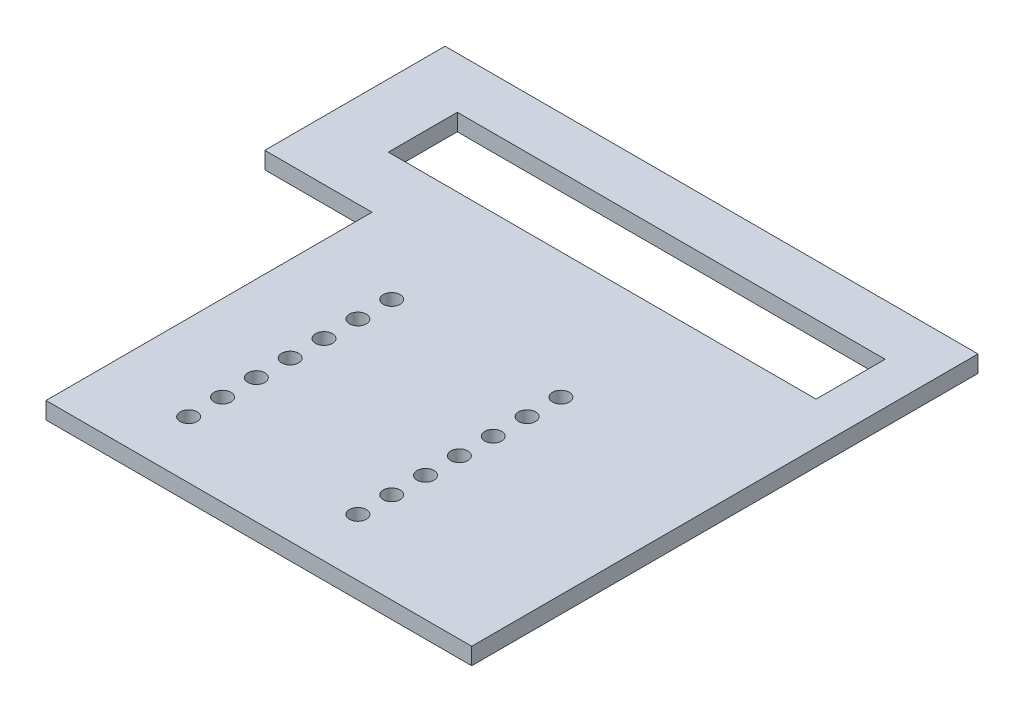
ISO-10303-21;
HEADER;
FILE_DESCRIPTION(('STEP AP214'),'2;1');
FILE_NAME('part.step','',(''),(''),'','','');
FILE_SCHEMA(('AUTOMOTIVE_DESIGN { 1 0 10303 214 1 1 1 1 }'));
ENDSEC;
DATA;
#1=APPLICATION_CONTEXT('core data for automotive mechanical design processes');
#2=APPLICATION_PROTOCOL_DEFINITION('international standard','automotive_design',2000,#1);
#3=PRODUCT_CONTEXT('',#1,'mechanical');
#4=PRODUCT('Part','Part','',(#3));
#5=PRODUCT_RELATED_PRODUCT_CATEGORY('part','',(#4));
#6=PRODUCT_DEFINITION_FORMATION('','',#4);
#7=PRODUCT_DEFINITION_CONTEXT('part definition',#1,'design');
#8=PRODUCT_DEFINITION('design','',#6,#7);
#9=PRODUCT_DEFINITION_SHAPE('','',#8);
#10=(LENGTH_UNIT() NAMED_UNIT(*) SI_UNIT(.MILLI.,.METRE.));
#11=(NAMED_UNIT(*) PLANE_ANGLE_UNIT() SI_UNIT($,.RADIAN.));
#12=(NAMED_UNIT(*) SI_UNIT($,.STERADIAN.) SOLID_ANGLE_UNIT());
#13=UNCERTAINTY_MEASURE_WITH_UNIT(LENGTH_MEASURE(1.E-05),#10,'distance_accuracy_value','');
#14=(GEOMETRIC_REPRESENTATION_CONTEXT(3) GLOBAL_UNCERTAINTY_ASSIGNED_CONTEXT((#13)) GLOBAL_UNIT_ASSIGNED_CONTEXT((#10,
#11,#12)) REPRESENTATION_CONTEXT('',''));
#15=CARTESIAN_POINT('',(0.,0.,0.));
#16=DIRECTION('',(0.,0.,1.));
#17=DIRECTION('',(1.,0.,0.));
#18=AXIS2_PLACEMENT_3D('',#15,#16,#17);
#19=CARTESIAN_POINT('',(-80.,-3.175,-112.5));
#20=DIRECTION('',(0.,0.,-1.));
#21=DIRECTION('',(-1.,0.,0.));
#22=AXIS2_PLACEMENT_3D('',#19,#20,#21);
#23=PLANE('',#22);
#24=DIRECTION('',(0.,-1.,0.));
#25=VECTOR('',#24,1.);
#26=CARTESIAN_POINT('',(0.,-3.175,-112.5));
#27=LINE('',#26,#25);
#28=CARTESIAN_POINT('',(0.,0.,-112.5));
#29=VERTEX_POINT('',#28);
#30=CARTESIAN_POINT('',(0.,-3.175,-112.5));
#31=VERTEX_POINT('',#30);
#32=EDGE_CURVE('E149',#29,#31,#27,.T.);
#33=ORIENTED_EDGE('',*,*,#32,.F.);
#34=DIRECTION('',(-1.,0.,0.));
#35=VECTOR('',#34,1.);
#36=CARTESIAN_POINT('',(-80.,0.,-112.5));
#37=LINE('',#36,#35);
#38=CARTESIAN_POINT('',(100.,0.,-112.5));
#39=VERTEX_POINT('',#38);
#40=EDGE_CURVE('E267',#39,#29,#37,.T.);
#41=ORIENTED_EDGE('',*,*,#40,.F.);
#42=DIRECTION('',(0.,1.,0.));
#43=VECTOR('',#42,1.);
#44=CARTESIAN_POINT('',(100.,-3.175,-112.5));
#45=LINE('',#44,#43);
#46=CARTESIAN_POINT('',(100.,-3.175,-112.5));
#47=VERTEX_POINT('',#46);
#48=EDGE_CURVE('E11',#47,#39,#45,.T.);
#49=ORIENTED_EDGE('',*,*,#48,.F.);
#50=DIRECTION('',(-1.,0.,0.));
#51=VECTOR('',#50,1.);
#52=CARTESIAN_POINT('',(-80.,-3.175,-112.5));
#53=LINE('',#52,#51);
#54=EDGE_CURVE('E41',#47,#31,#53,.T.);
#55=ORIENTED_EDGE('',*,*,#54,.T.);
#56=EDGE_LOOP('',(#33,#41,#49,#55));
#57=FACE_BOUND('',#56,.T.);
#58=ADVANCED_FACE('F33',(#57),#23,.T.);
#59=CARTESIAN_POINT('',(100.,-3.175,-112.5));
#60=DIRECTION('',(1.,0.,0.));
#61=DIRECTION('',(0.,0.,-1.));
#62=AXIS2_PLACEMENT_3D('',#59,#60,#61);
#63=PLANE('',#62);
#64=DIRECTION('',(0.,1.,0.));
#65=VECTOR('',#64,1.);
#66=CARTESIAN_POINT('',(100.,-3.175,-17.4996584070186));
#67=LINE('',#66,#65);
#68=CARTESIAN_POINT('',(100.,-3.175,-17.4996584070186));
#69=VERTEX_POINT('',#68);
#70=CARTESIAN_POINT('',(100.,0.,-17.4996584070186));
#71=VERTEX_POINT('',#70);
#72=EDGE_CURVE('E48',#69,#71,#67,.T.);
#73=ORIENTED_EDGE('',*,*,#72,.F.);
#74=DIRECTION('',(0.,0.,-1.));
#75=VECTOR('',#74,1.);
#76=CARTESIAN_POINT('',(100.,-3.175,-112.5));
#77=LINE('',#76,#75);
#78=EDGE_CURVE('E131',#69,#47,#77,.T.);
#79=ORIENTED_EDGE('',*,*,#78,.T.);
#80=ORIENTED_EDGE('',*,*,#48,.T.);
#81=DIRECTION('',(0.,0.,-1.));
#82=VECTOR('',#81,1.);
#83=CARTESIAN_POINT('',(100.,0.,-112.5));
#84=LINE('',#83,#82);
#85=EDGE_CURVE('E259',#71,#39,#84,.T.);
#86=ORIENTED_EDGE('',*,*,#85,.F.);
#87=EDGE_LOOP('',(#73,#79,#80,#86));
#88=FACE_BOUND('',#87,.T.);
#89=ADVANCED_FACE('F35',(#88),#63,.T.);
#90=CARTESIAN_POINT('',(-80.,-3.175,0.));
#91=DIRECTION('',(0.,1.,0.));
#92=DIRECTION('',(0.,0.,1.));
#93=AXIS2_PLACEMENT_3D('',#90,#91,#92);
#94=PLANE('',#93);
#95=CARTESIAN_POINT('',(67.8940457021954,-3.175,-28.2447999999999));
#96=DIRECTION('',(0.,1.,0.));
#97=DIRECTION('',(0.,0.,1.));
#98=AXIS2_PLACEMENT_3D('',#95,#96,#97);
#99=CIRCLE('',#98,1.58749999999999);
#100=CARTESIAN_POINT('',(67.8940457021954,-3.175,-26.6573));
#101=VERTEX_POINT('',#100);
#102=EDGE_CURVE('E152',#101,#101,#99,.T.);
#103=ORIENTED_EDGE('',*,*,#102,.T.);
#104=EDGE_LOOP('',(#103));
#105=FACE_BOUND('',#104,.T.);
#106=CARTESIAN_POINT('',(67.8940457021954,-3.175,-34.5947999999999));
#107=DIRECTION('',(0.,1.,0.));
#108=DIRECTION('',(0.,0.,1.));
#109=AXIS2_PLACEMENT_3D('',#106,#107,#108);
#110=CIRCLE('',#109,1.58749999999999);
#111=CARTESIAN_POINT('',(67.8940457021954,-3.175,-33.0073));
#112=VERTEX_POINT('',#111);
#113=EDGE_CURVE('E158',#112,#112,#110,.T.);
#114=ORIENTED_EDGE('',*,*,#113,.T.);
#115=EDGE_LOOP('',(#114));
#116=FACE_BOUND('',#115,.T.);
#117=CARTESIAN_POINT('',(67.8940457021954,-3.175,-40.9448));
#118=DIRECTION('',(0.,1.,0.));
#119=DIRECTION('',(0.,0.,1.));
#120=AXIS2_PLACEMENT_3D('',#117,#118,#119);
#121=CIRCLE('',#120,1.58749999999999);
#122=CARTESIAN_POINT('',(67.8940457021954,-3.175,-39.3573));
#123=VERTEX_POINT('',#122);
#124=EDGE_CURVE('E164',#123,#123,#121,.T.);
#125=ORIENTED_EDGE('',*,*,#124,.T.);
#126=EDGE_LOOP('',(#125));
#127=FACE_BOUND('',#126,.T.);
#128=CARTESIAN_POINT('',(67.8940457021954,-3.175,-47.2948));
#129=DIRECTION('',(0.,1.,0.));
#130=DIRECTION('',(0.,0.,1.));
#131=AXIS2_PLACEMENT_3D('',#128,#129,#130);
#132=CIRCLE('',#131,1.58749999999999);
#133=CARTESIAN_POINT('',(67.8940457021954,-3.175,-45.7073));
#134=VERTEX_POINT('',#133);
#135=EDGE_CURVE('E170',#134,#134,#132,.T.);
#136=ORIENTED_EDGE('',*,*,#135,.T.);
#137=EDGE_LOOP('',(#136));
#138=FACE_BOUND('',#137,.T.);
#139=CARTESIAN_POINT('',(67.8940457021954,-3.175,-53.6448));
#140=DIRECTION('',(0.,1.,0.));
#141=DIRECTION('',(0.,0.,1.));
#142=AXIS2_PLACEMENT_3D('',#139,#140,#141);
#143=CIRCLE('',#142,1.58749999999999);
#144=CARTESIAN_POINT('',(67.8940457021954,-3.175,-52.0573));
#145=VERTEX_POINT('',#144);
#146=EDGE_CURVE('E176',#145,#145,#143,.T.);
#147=ORIENTED_EDGE('',*,*,#146,.T.);
#148=EDGE_LOOP('',(#147));
#149=FACE_BOUND('',#148,.T.);
#150=CARTESIAN_POINT('',(67.8940457021954,-3.175,-59.9948));
#151=DIRECTION('',(0.,1.,0.));
#152=DIRECTION('',(0.,0.,1.));
#153=AXIS2_PLACEMENT_3D('',#150,#151,#152);
#154=CIRCLE('',#153,1.58749999999999);
#155=CARTESIAN_POINT('',(67.8940457021954,-3.175,-58.4073));
#156=VERTEX_POINT('',#155);
#157=EDGE_CURVE('E182',#156,#156,#154,.T.);
#158=ORIENTED_EDGE('',*,*,#157,.T.);
#159=EDGE_LOOP('',(#158));
#160=FACE_BOUND('',#159,.T.);
#161=CARTESIAN_POINT('',(67.8940457021954,-3.175,-66.3448));
#162=DIRECTION('',(0.,1.,0.));
#163=DIRECTION('',(0.,0.,1.));
#164=AXIS2_PLACEMENT_3D('',#161,#162,#163);
#165=CIRCLE('',#164,1.58749999999999);
#166=CARTESIAN_POINT('',(67.8940457021954,-3.175,-64.7573));
#167=VERTEX_POINT('',#166);
#168=EDGE_CURVE('E188',#167,#167,#165,.T.);
#169=ORIENTED_EDGE('',*,*,#168,.T.);
#170=EDGE_LOOP('',(#169));
#171=FACE_BOUND('',#170,.T.);
#172=CARTESIAN_POINT('',(36.1440457021954,-3.175,-28.2447999999999));
#173=DIRECTION('',(0.,1.,0.));
#174=DIRECTION('',(0.,0.,1.));
#175=AXIS2_PLACEMENT_3D('',#172,#173,#174);
#176=CIRCLE('',#175,1.5875);
#177=CARTESIAN_POINT('',(36.1440457021954,-3.175,-26.6572999999999));
#178=VERTEX_POINT('',#177);
#179=EDGE_CURVE('E194',#178,#178,#176,.T.);
#180=ORIENTED_EDGE('',*,*,#179,.T.);
#181=EDGE_LOOP('',(#180));
#182=FACE_BOUND('',#181,.T.);
#183=CARTESIAN_POINT('',(36.1440457021954,-3.175,-34.5947999999999));
#184=DIRECTION('',(0.,1.,0.));
#185=DIRECTION('',(0.,0.,1.));
#186=AXIS2_PLACEMENT_3D('',#183,#184,#185);
#187=CIRCLE('',#186,1.5875);
#188=CARTESIAN_POINT('',(36.1440457021954,-3.175,-33.0072999999999));
#189=VERTEX_POINT('',#188);
#190=EDGE_CURVE('E200',#189,#189,#187,.T.);
#191=ORIENTED_EDGE('',*,*,#190,.T.);
#192=EDGE_LOOP('',(#191));
#193=FACE_BOUND('',#192,.T.);
#194=CARTESIAN_POINT('',(36.1440457021954,-3.175,-40.9448));
#195=DIRECTION('',(0.,1.,0.));
#196=DIRECTION('',(0.,0.,1.));
#197=AXIS2_PLACEMENT_3D('',#194,#195,#196);
#198=CIRCLE('',#197,1.5875);
#199=CARTESIAN_POINT('',(36.1440457021954,-3.175,-39.3573));
#200=VERTEX_POINT('',#199);
#201=EDGE_CURVE('E206',#200,#200,#198,.T.);
#202=ORIENTED_EDGE('',*,*,#201,.T.);
#203=EDGE_LOOP('',(#202));
#204=FACE_BOUND('',#203,.T.);
#205=CARTESIAN_POINT('',(36.1440457021954,-3.175,-47.2948));
#206=DIRECTION('',(0.,1.,0.));
#207=DIRECTION('',(0.,0.,1.));
#208=AXIS2_PLACEMENT_3D('',#205,#206,#207);
#209=CIRCLE('',#208,1.5875);
#210=CARTESIAN_POINT('',(36.1440457021954,-3.175,-45.7073));
#211=VERTEX_POINT('',#210);
#212=EDGE_CURVE('E212',#211,#211,#209,.T.);
#213=ORIENTED_EDGE('',*,*,#212,.T.);
#214=EDGE_LOOP('',(#213));
#215=FACE_BOUND('',#214,.T.);
#216=CARTESIAN_POINT('',(36.1440457021954,-3.175,-53.6447999999999));
#217=DIRECTION('',(0.,1.,0.));
#218=DIRECTION('',(0.,0.,1.));
#219=AXIS2_PLACEMENT_3D('',#216,#217,#218);
#220=CIRCLE('',#219,1.5875);
#221=CARTESIAN_POINT('',(36.1440457021954,-3.175,-52.0572999999999));
#222=VERTEX_POINT('',#221);
#223=EDGE_CURVE('E218',#222,#222,#220,.T.);
#224=ORIENTED_EDGE('',*,*,#223,.T.);
#225=EDGE_LOOP('',(#224));
#226=FACE_BOUND('',#225,.T.);
#227=CARTESIAN_POINT('',(36.1440457021954,-3.175,-59.9948));
#228=DIRECTION('',(0.,1.,0.));
#229=DIRECTION('',(0.,0.,1.));
#230=AXIS2_PLACEMENT_3D('',#227,#228,#229);
#231=CIRCLE('',#230,1.5875);
#232=CARTESIAN_POINT('',(36.1440457021954,-3.175,-58.4073));
#233=VERTEX_POINT('',#232);
#234=EDGE_CURVE('E224',#233,#233,#231,.T.);
#235=ORIENTED_EDGE('',*,*,#234,.T.);
#236=EDGE_LOOP('',(#235));
#237=FACE_BOUND('',#236,.T.);
#238=CARTESIAN_POINT('',(36.1440457021954,-3.175,-66.3448));
#239=DIRECTION('',(0.,1.,0.));
#240=DIRECTION('',(0.,0.,1.));
#241=AXIS2_PLACEMENT_3D('',#238,#239,#240);
#242=CIRCLE('',#241,1.5875);
#243=CARTESIAN_POINT('',(36.1440457021954,-3.175,-64.7573));
#244=VERTEX_POINT('',#243);
#245=EDGE_CURVE('E230',#244,#244,#242,.T.);
#246=ORIENTED_EDGE('',*,*,#245,.T.);
#247=EDGE_LOOP('',(#246));
#248=FACE_BOUND('',#247,.T.);
#249=DIRECTION('',(-1.,0.,0.));
#250=VECTOR('',#249,1.);
#251=CARTESIAN_POINT('',(11.8870457021954,-3.175,-102.9208));
#252=LINE('',#251,#250);
#253=CARTESIAN_POINT('',(92.1510457021954,-3.175,-102.9208));
#254=VERTEX_POINT('',#253);
#255=CARTESIAN_POINT('',(11.8870457021954,-3.175,-102.9208));
#256=VERTEX_POINT('',#255);
#257=EDGE_CURVE('E244',#254,#256,#252,.T.);
#258=ORIENTED_EDGE('',*,*,#257,.T.);
#259=DIRECTION('',(0.,0.,1.));
#260=VECTOR('',#259,1.);
#261=CARTESIAN_POINT('',(11.8870457021954,-3.175,-89.9668));
#262=LINE('',#261,#260);
#263=CARTESIAN_POINT('',(11.8870457021954,-3.175,-89.9668));
#264=VERTEX_POINT('',#263);
#265=EDGE_CURVE('E236',#256,#264,#262,.T.);
#266=ORIENTED_EDGE('',*,*,#265,.T.);
#267=DIRECTION('',(1.,0.,0.));
#268=VECTOR('',#267,1.);
#269=CARTESIAN_POINT('',(11.8870457021954,-3.175,-89.9668));
#270=LINE('',#269,#268);
#271=CARTESIAN_POINT('',(92.1510457021954,-3.175,-89.9668));
#272=VERTEX_POINT('',#271);
#273=EDGE_CURVE('E239',#264,#272,#270,.T.);
#274=ORIENTED_EDGE('',*,*,#273,.T.);
#275=DIRECTION('',(0.,0.,-1.));
#276=VECTOR('',#275,1.);
#277=CARTESIAN_POINT('',(92.1510457021954,-3.175,-89.9668));
#278=LINE('',#277,#276);
#279=EDGE_CURVE('E56',#272,#254,#278,.T.);
#280=ORIENTED_EDGE('',*,*,#279,.T.);
#281=EDGE_LOOP('',(#258,#266,#274,#280));
#282=FACE_BOUND('',#281,.T.);
#283=DIRECTION('',(-1.,0.,0.));
#284=VECTOR('',#283,1.);
#285=CARTESIAN_POINT('',(0.,-3.175,-78.6728109926003));
#286=LINE('',#285,#284);
#287=CARTESIAN_POINT('',(20.1250867978047,-3.175,-78.6728109926003));
#288=VERTEX_POINT('',#287);
#289=CARTESIAN_POINT('',(0.,-3.175,-78.6728109926003));
#290=VERTEX_POINT('',#289);
#291=EDGE_CURVE('E126',#288,#290,#286,.T.);
#292=ORIENTED_EDGE('',*,*,#291,.T.);
#293=DIRECTION('',(0.,0.,-1.));
#294=VECTOR('',#293,1.);
#295=CARTESIAN_POINT('',(0.,-3.175,-127.979520784606));
#296=LINE('',#295,#294);
#297=EDGE_CURVE('E118',#290,#31,#296,.T.);
#298=ORIENTED_EDGE('',*,*,#297,.T.);
#299=ORIENTED_EDGE('',*,*,#54,.F.);
#300=ORIENTED_EDGE('',*,*,#78,.F.);
#301=DIRECTION('',(-1.,0.,0.));
#302=VECTOR('',#301,1.);
#303=CARTESIAN_POINT('',(20.1250867978047,-3.175,-17.4996584070186));
#304=LINE('',#303,#302);
#305=CARTESIAN_POINT('',(20.1250867978047,-3.175,-17.4996584070186));
#306=VERTEX_POINT('',#305);
#307=EDGE_CURVE('E112',#69,#306,#304,.T.);
#308=ORIENTED_EDGE('',*,*,#307,.T.);
#309=DIRECTION('',(0.,0.,-1.));
#310=VECTOR('',#309,1.);
#311=CARTESIAN_POINT('',(20.1250867978047,-3.175,-78.6728109926003));
#312=LINE('',#311,#310);
#313=EDGE_CURVE('E121',#306,#288,#312,.T.);
#314=ORIENTED_EDGE('',*,*,#313,.T.);
#315=EDGE_LOOP('',(#292,#298,#299,#300,#308,#314));
#316=FACE_BOUND('',#315,.T.);
#317=ADVANCED_FACE('F129',(#105,#116,#127,#138,#149,#160,#171,#182,#193,#204,#215,#226,#237,
#248,#282,#316),#94,.F.);
#318=CARTESIAN_POINT('',(-80.,0.,0.));
#319=DIRECTION('',(0.,1.,0.));
#320=DIRECTION('',(0.,0.,1.));
#321=AXIS2_PLACEMENT_3D('',#318,#319,#320);
#322=PLANE('',#321);
#323=DIRECTION('',(0.,0.,-1.));
#324=VECTOR('',#323,1.);
#325=CARTESIAN_POINT('',(0.,0.,-127.979520784606));
#326=LINE('',#325,#324);
#327=CARTESIAN_POINT('',(0.,0.,-78.6728109926003));
#328=VERTEX_POINT('',#327);
#329=EDGE_CURVE('E132',#328,#29,#326,.T.);
#330=ORIENTED_EDGE('',*,*,#329,.F.);
#331=DIRECTION('',(-1.,0.,0.));
#332=VECTOR('',#331,1.);
#333=CARTESIAN_POINT('',(0.,0.,-78.6728109926003));
#334=LINE('',#333,#332);
#335=CARTESIAN_POINT('',(20.1250867978047,0.,-78.6728109926003));
#336=VERTEX_POINT('',#335);
#337=EDGE_CURVE('E134',#336,#328,#334,.T.);
#338=ORIENTED_EDGE('',*,*,#337,.F.);
#339=DIRECTION('',(0.,0.,-1.));
#340=VECTOR('',#339,1.);
#341=CARTESIAN_POINT('',(20.1250867978047,0.,-78.6728109926003));
#342=LINE('',#341,#340);
#343=CARTESIAN_POINT('',(20.1250867978047,0.,-17.4996584070186));
#344=VERTEX_POINT('',#343);
#345=EDGE_CURVE('E141',#344,#336,#342,.T.);
#346=ORIENTED_EDGE('',*,*,#345,.F.);
#347=DIRECTION('',(-1.,0.,0.));
#348=VECTOR('',#347,1.);
#349=CARTESIAN_POINT('',(20.1250867978047,0.,-17.4996584070186));
#350=LINE('',#349,#348);
#351=EDGE_CURVE('E113',#71,#344,#350,.T.);
#352=ORIENTED_EDGE('',*,*,#351,.F.);
#353=ORIENTED_EDGE('',*,*,#85,.T.);
#354=ORIENTED_EDGE('',*,*,#40,.T.);
#355=EDGE_LOOP('',(#330,#338,#346,#352,#353,#354));
#356=FACE_BOUND('',#355,.T.);
#357=CARTESIAN_POINT('',(67.8940457021954,0.,-28.2447999999999));
#358=DIRECTION('',(0.,1.,0.));
#359=DIRECTION('',(0.,0.,1.));
#360=AXIS2_PLACEMENT_3D('',#357,#358,#359);
#361=CIRCLE('',#360,1.58749999999999);
#362=CARTESIAN_POINT('',(67.8940457021954,0.,-26.6573));
#363=VERTEX_POINT('',#362);
#364=EDGE_CURVE('E151',#363,#363,#361,.T.);
#365=ORIENTED_EDGE('',*,*,#364,.F.);
#366=EDGE_LOOP('',(#365));
#367=FACE_BOUND('',#366,.T.);
#368=CARTESIAN_POINT('',(67.8940457021954,0.,-34.5947999999999));
#369=DIRECTION('',(0.,1.,0.));
#370=DIRECTION('',(0.,0.,1.));
#371=AXIS2_PLACEMENT_3D('',#368,#369,#370);
#372=CIRCLE('',#371,1.58749999999999);
#373=CARTESIAN_POINT('',(67.8940457021954,0.,-33.0073));
#374=VERTEX_POINT('',#373);
#375=EDGE_CURVE('E155',#374,#374,#372,.T.);
#376=ORIENTED_EDGE('',*,*,#375,.F.);
#377=EDGE_LOOP('',(#376));
#378=FACE_BOUND('',#377,.T.);
#379=CARTESIAN_POINT('',(67.8940457021954,0.,-40.9448));
#380=DIRECTION('',(0.,1.,0.));
#381=DIRECTION('',(0.,0.,1.));
#382=AXIS2_PLACEMENT_3D('',#379,#380,#381);
#383=CIRCLE('',#382,1.58749999999999);
#384=CARTESIAN_POINT('',(67.8940457021954,0.,-39.3573));
#385=VERTEX_POINT('',#384);
#386=EDGE_CURVE('E161',#385,#385,#383,.T.);
#387=ORIENTED_EDGE('',*,*,#386,.F.);
#388=EDGE_LOOP('',(#387));
#389=FACE_BOUND('',#388,.T.);
#390=CARTESIAN_POINT('',(67.8940457021954,0.,-47.2948));
#391=DIRECTION('',(0.,1.,0.));
#392=DIRECTION('',(0.,0.,1.));
#393=AXIS2_PLACEMENT_3D('',#390,#391,#392);
#394=CIRCLE('',#393,1.58749999999999);
#395=CARTESIAN_POINT('',(67.8940457021954,0.,-45.7073));
#396=VERTEX_POINT('',#395);
#397=EDGE_CURVE('E167',#396,#396,#394,.T.);
#398=ORIENTED_EDGE('',*,*,#397,.F.);
#399=EDGE_LOOP('',(#398));
#400=FACE_BOUND('',#399,.T.);
#401=CARTESIAN_POINT('',(67.8940457021954,0.,-53.6448));
#402=DIRECTION('',(0.,1.,0.));
#403=DIRECTION('',(0.,0.,1.));
#404=AXIS2_PLACEMENT_3D('',#401,#402,#403);
#405=CIRCLE('',#404,1.58749999999999);
#406=CARTESIAN_POINT('',(67.8940457021954,0.,-52.0573));
#407=VERTEX_POINT('',#406);
#408=EDGE_CURVE('E173',#407,#407,#405,.T.);
#409=ORIENTED_EDGE('',*,*,#408,.F.);
#410=EDGE_LOOP('',(#409));
#411=FACE_BOUND('',#410,.T.);
#412=CARTESIAN_POINT('',(67.8940457021954,0.,-59.9948));
#413=DIRECTION('',(0.,1.,0.));
#414=DIRECTION('',(0.,0.,1.));
#415=AXIS2_PLACEMENT_3D('',#412,#413,#414);
#416=CIRCLE('',#415,1.58749999999999);
#417=CARTESIAN_POINT('',(67.8940457021954,0.,-58.4073));
#418=VERTEX_POINT('',#417);
#419=EDGE_CURVE('E179',#418,#418,#416,.T.);
#420=ORIENTED_EDGE('',*,*,#419,.F.);
#421=EDGE_LOOP('',(#420));
#422=FACE_BOUND('',#421,.T.);
#423=CARTESIAN_POINT('',(67.8940457021954,0.,-66.3448));
#424=DIRECTION('',(0.,1.,0.));
#425=DIRECTION('',(0.,0.,1.));
#426=AXIS2_PLACEMENT_3D('',#423,#424,#425);
#427=CIRCLE('',#426,1.58749999999999);
#428=CARTESIAN_POINT('',(67.8940457021954,0.,-64.7573));
#429=VERTEX_POINT('',#428);
#430=EDGE_CURVE('E185',#429,#429,#427,.T.);
#431=ORIENTED_EDGE('',*,*,#430,.F.);
#432=EDGE_LOOP('',(#431));
#433=FACE_BOUND('',#432,.T.);
#434=CARTESIAN_POINT('',(36.1440457021954,0.,-28.2447999999999));
#435=DIRECTION('',(0.,1.,0.));
#436=DIRECTION('',(0.,0.,1.));
#437=AXIS2_PLACEMENT_3D('',#434,#435,#436);
#438=CIRCLE('',#437,1.5875);
#439=CARTESIAN_POINT('',(36.1440457021954,0.,-26.6572999999999));
#440=VERTEX_POINT('',#439);
#441=EDGE_CURVE('E191',#440,#440,#438,.T.);
#442=ORIENTED_EDGE('',*,*,#441,.F.);
#443=EDGE_LOOP('',(#442));
#444=FACE_BOUND('',#443,.T.);
#445=CARTESIAN_POINT('',(36.1440457021954,0.,-34.5947999999999));
#446=DIRECTION('',(0.,1.,0.));
#447=DIRECTION('',(0.,0.,1.));
#448=AXIS2_PLACEMENT_3D('',#445,#446,#447);
#449=CIRCLE('',#448,1.5875);
#450=CARTESIAN_POINT('',(36.1440457021954,0.,-33.0072999999999));
#451=VERTEX_POINT('',#450);
#452=EDGE_CURVE('E197',#451,#451,#449,.T.);
#453=ORIENTED_EDGE('',*,*,#452,.F.);
#454=EDGE_LOOP('',(#453));
#455=FACE_BOUND('',#454,.T.);
#456=CARTESIAN_POINT('',(36.1440457021954,0.,-40.9448));
#457=DIRECTION('',(0.,1.,0.));
#458=DIRECTION('',(0.,0.,1.));
#459=AXIS2_PLACEMENT_3D('',#456,#457,#458);
#460=CIRCLE('',#459,1.5875);
#461=CARTESIAN_POINT('',(36.1440457021954,0.,-39.3573));
#462=VERTEX_POINT('',#461);
#463=EDGE_CURVE('E203',#462,#462,#460,.T.);
#464=ORIENTED_EDGE('',*,*,#463,.F.);
#465=EDGE_LOOP('',(#464));
#466=FACE_BOUND('',#465,.T.);
#467=CARTESIAN_POINT('',(36.1440457021954,0.,-47.2948));
#468=DIRECTION('',(0.,1.,0.));
#469=DIRECTION('',(0.,0.,1.));
#470=AXIS2_PLACEMENT_3D('',#467,#468,#469);
#471=CIRCLE('',#470,1.5875);
#472=CARTESIAN_POINT('',(36.1440457021954,0.,-45.7073));
#473=VERTEX_POINT('',#472);
#474=EDGE_CURVE('E209',#473,#473,#471,.T.);
#475=ORIENTED_EDGE('',*,*,#474,.F.);
#476=EDGE_LOOP('',(#475));
#477=FACE_BOUND('',#476,.T.);
#478=CARTESIAN_POINT('',(36.1440457021954,0.,-53.6447999999999));
#479=DIRECTION('',(0.,1.,0.));
#480=DIRECTION('',(0.,0.,1.));
#481=AXIS2_PLACEMENT_3D('',#478,#479,#480);
#482=CIRCLE('',#481,1.5875);
#483=CARTESIAN_POINT('',(36.1440457021954,0.,-52.0572999999999));
#484=VERTEX_POINT('',#483);
#485=EDGE_CURVE('E215',#484,#484,#482,.T.);
#486=ORIENTED_EDGE('',*,*,#485,.F.);
#487=EDGE_LOOP('',(#486));
#488=FACE_BOUND('',#487,.T.);
#489=CARTESIAN_POINT('',(36.1440457021954,0.,-59.9948));
#490=DIRECTION('',(0.,1.,0.));
#491=DIRECTION('',(0.,0.,1.));
#492=AXIS2_PLACEMENT_3D('',#489,#490,#491);
#493=CIRCLE('',#492,1.5875);
#494=CARTESIAN_POINT('',(36.1440457021954,0.,-58.4073));
#495=VERTEX_POINT('',#494);
#496=EDGE_CURVE('E221',#495,#495,#493,.T.);
#497=ORIENTED_EDGE('',*,*,#496,.F.);
#498=EDGE_LOOP('',(#497));
#499=FACE_BOUND('',#498,.T.);
#500=CARTESIAN_POINT('',(36.1440457021954,0.,-66.3448));
#501=DIRECTION('',(0.,1.,0.));
#502=DIRECTION('',(0.,0.,1.));
#503=AXIS2_PLACEMENT_3D('',#500,#501,#502);
#504=CIRCLE('',#503,1.5875);
#505=CARTESIAN_POINT('',(36.1440457021954,0.,-64.7573));
#506=VERTEX_POINT('',#505);
#507=EDGE_CURVE('E227',#506,#506,#504,.T.);
#508=ORIENTED_EDGE('',*,*,#507,.F.);
#509=EDGE_LOOP('',(#508));
#510=FACE_BOUND('',#509,.T.);
#511=DIRECTION('',(0.,0.,1.));
#512=VECTOR('',#511,1.);
#513=CARTESIAN_POINT('',(11.8870457021954,0.,-89.9668));
#514=LINE('',#513,#512);
#515=CARTESIAN_POINT('',(11.8870457021954,0.,-102.9208));
#516=VERTEX_POINT('',#515);
#517=CARTESIAN_POINT('',(11.8870457021954,0.,-89.9668));
#518=VERTEX_POINT('',#517);
#519=EDGE_CURVE('E233',#516,#518,#514,.T.);
#520=ORIENTED_EDGE('',*,*,#519,.F.);
#521=DIRECTION('',(-1.,0.,0.));
#522=VECTOR('',#521,1.);
#523=CARTESIAN_POINT('',(11.8870457021954,0.,-102.9208));
#524=LINE('',#523,#522);
#525=CARTESIAN_POINT('',(92.1510457021954,0.,-102.9208));
#526=VERTEX_POINT('',#525);
#527=EDGE_CURVE('E240',#526,#516,#524,.T.);
#528=ORIENTED_EDGE('',*,*,#527,.F.);
#529=DIRECTION('',(0.,0.,-1.));
#530=VECTOR('',#529,1.);
#531=CARTESIAN_POINT('',(92.1510457021954,0.,-89.9668));
#532=LINE('',#531,#530);
#533=CARTESIAN_POINT('',(92.1510457021954,0.,-89.9668));
#534=VERTEX_POINT('',#533);
#535=EDGE_CURVE('E252',#534,#526,#532,.T.);
#536=ORIENTED_EDGE('',*,*,#535,.F.);
#537=DIRECTION('',(1.,0.,0.));
#538=VECTOR('',#537,1.);
#539=CARTESIAN_POINT('',(11.8870457021954,0.,-89.9668));
#540=LINE('',#539,#538);
#541=EDGE_CURVE('E249',#518,#534,#540,.T.);
#542=ORIENTED_EDGE('',*,*,#541,.F.);
#543=EDGE_LOOP('',(#520,#528,#536,#542));
#544=FACE_BOUND('',#543,.T.);
#545=ADVANCED_FACE('F274',(#356,#367,#378,#389,#400,#411,#422,#433,#444,#455,#466,#477,#488,
#499,#510,#544),#322,.T.);
#546=CARTESIAN_POINT('',(11.8870457021954,-3.175,-89.9668));
#547=DIRECTION('',(-1.,0.,0.));
#548=DIRECTION('',(0.,0.,1.));
#549=AXIS2_PLACEMENT_3D('',#546,#547,#548);
#550=PLANE('',#549);
#551=ORIENTED_EDGE('',*,*,#519,.T.);
#552=DIRECTION('',(0.,1.,0.));
#553=VECTOR('',#552,1.);
#554=CARTESIAN_POINT('',(11.8870457021954,-3.175,-89.9668));
#555=LINE('',#554,#553);
#556=EDGE_CURVE('E247',#264,#518,#555,.T.);
#557=ORIENTED_EDGE('',*,*,#556,.F.);
#558=ORIENTED_EDGE('',*,*,#265,.F.);
#559=DIRECTION('',(0.,1.,0.));
#560=VECTOR('',#559,1.);
#561=CARTESIAN_POINT('',(11.8870457021954,-3.175,-102.9208));
#562=LINE('',#561,#560);
#563=EDGE_CURVE('E257',#256,#516,#562,.T.);
#564=ORIENTED_EDGE('',*,*,#563,.T.);
#565=EDGE_LOOP('',(#551,#557,#558,#564));
#566=FACE_BOUND('',#565,.T.);
#567=ADVANCED_FACE('F298',(#566),#550,.F.);
#568=CARTESIAN_POINT('',(11.8870457021954,-3.175,-102.9208));
#569=DIRECTION('',(0.,0.,-1.));
#570=DIRECTION('',(-1.,0.,0.));
#571=AXIS2_PLACEMENT_3D('',#568,#569,#570);
#572=PLANE('',#571);
#573=ORIENTED_EDGE('',*,*,#527,.T.);
#574=ORIENTED_EDGE('',*,*,#563,.F.);
#575=ORIENTED_EDGE('',*,*,#257,.F.);
#576=DIRECTION('',(0.,1.,0.));
#577=VECTOR('',#576,1.);
#578=CARTESIAN_POINT('',(92.1510457021954,-3.175,-102.9208));
#579=LINE('',#578,#577);
#580=EDGE_CURVE('E260',#254,#526,#579,.T.);
#581=ORIENTED_EDGE('',*,*,#580,.T.);
#582=EDGE_LOOP('',(#573,#574,#575,#581));
#583=FACE_BOUND('',#582,.T.);
#584=ADVANCED_FACE('F302',(#583),#572,.F.);
#585=CARTESIAN_POINT('',(92.1510457021954,-3.175,-89.9668));
#586=DIRECTION('',(1.,0.,0.));
#587=DIRECTION('',(0.,0.,-1.));
#588=AXIS2_PLACEMENT_3D('',#585,#586,#587);
#589=PLANE('',#588);
#590=ORIENTED_EDGE('',*,*,#535,.T.);
#591=ORIENTED_EDGE('',*,*,#580,.F.);
#592=ORIENTED_EDGE('',*,*,#279,.F.);
#593=DIRECTION('',(0.,1.,0.));
#594=VECTOR('',#593,1.);
#595=CARTESIAN_POINT('',(92.1510457021954,-3.175,-89.9668));
#596=LINE('',#595,#594);
#597=EDGE_CURVE('E262',#272,#534,#596,.T.);
#598=ORIENTED_EDGE('',*,*,#597,.T.);
#599=EDGE_LOOP('',(#590,#591,#592,#598));
#600=FACE_BOUND('',#599,.T.);
#601=ADVANCED_FACE('F308',(#600),#589,.F.);
#602=CARTESIAN_POINT('',(11.8870457021954,-3.175,-89.9668));
#603=DIRECTION('',(0.,0.,1.));
#604=DIRECTION('',(1.,0.,0.));
#605=AXIS2_PLACEMENT_3D('',#602,#603,#604);
#606=PLANE('',#605);
#607=ORIENTED_EDGE('',*,*,#541,.T.);
#608=ORIENTED_EDGE('',*,*,#597,.F.);
#609=ORIENTED_EDGE('',*,*,#273,.F.);
#610=ORIENTED_EDGE('',*,*,#556,.T.);
#611=EDGE_LOOP('',(#607,#608,#609,#610));
#612=FACE_BOUND('',#611,.T.);
#613=ADVANCED_FACE('F304',(#612),#606,.F.);
#614=CARTESIAN_POINT('',(36.1440457021954,-3.175,-66.3448));
#615=DIRECTION('',(0.,1.,0.));
#616=DIRECTION('',(0.,0.,1.));
#617=AXIS2_PLACEMENT_3D('',#614,#615,#616);
#618=CYLINDRICAL_SURFACE('',#617,1.5875);
#619=ORIENTED_EDGE('',*,*,#245,.F.);
#620=EDGE_LOOP('',(#619));
#621=FACE_BOUND('',#620,.T.);
#622=ORIENTED_EDGE('',*,*,#507,.T.);
#623=EDGE_LOOP('',(#622));
#624=FACE_BOUND('',#623,.T.);
#625=ADVANCED_FACE('F307',(#621,#624),#618,.F.);
#626=CARTESIAN_POINT('',(36.1440457021954,-3.175,-59.9948));
#627=DIRECTION('',(0.,1.,0.));
#628=DIRECTION('',(0.,0.,1.));
#629=AXIS2_PLACEMENT_3D('',#626,#627,#628);
#630=CYLINDRICAL_SURFACE('',#629,1.5875);
#631=ORIENTED_EDGE('',*,*,#234,.F.);
#632=EDGE_LOOP('',(#631));
#633=FACE_BOUND('',#632,.T.);
#634=ORIENTED_EDGE('',*,*,#496,.T.);
#635=EDGE_LOOP('',(#634));
#636=FACE_BOUND('',#635,.T.);
#637=ADVANCED_FACE('F317',(#633,#636),#630,.F.);
#638=CARTESIAN_POINT('',(36.1440457021954,-3.175,-53.6447999999999));
#639=DIRECTION('',(0.,1.,0.));
#640=DIRECTION('',(0.,0.,1.));
#641=AXIS2_PLACEMENT_3D('',#638,#639,#640);
#642=CYLINDRICAL_SURFACE('',#641,1.5875);
#643=ORIENTED_EDGE('',*,*,#223,.F.);
#644=EDGE_LOOP('',(#643));
#645=FACE_BOUND('',#644,.T.);
#646=ORIENTED_EDGE('',*,*,#485,.T.);
#647=EDGE_LOOP('',(#646));
#648=FACE_BOUND('',#647,.T.);
#649=ADVANCED_FACE('F321',(#645,#648),#642,.F.);
#650=CARTESIAN_POINT('',(36.1440457021954,-3.175,-47.2948));
#651=DIRECTION('',(0.,1.,0.));
#652=DIRECTION('',(0.,0.,1.));
#653=AXIS2_PLACEMENT_3D('',#650,#651,#652);
#654=CYLINDRICAL_SURFACE('',#653,1.5875);
#655=ORIENTED_EDGE('',*,*,#212,.F.);
#656=EDGE_LOOP('',(#655));
#657=FACE_BOUND('',#656,.T.);
#658=ORIENTED_EDGE('',*,*,#474,.T.);
#659=EDGE_LOOP('',(#658));
#660=FACE_BOUND('',#659,.T.);
#661=ADVANCED_FACE('F325',(#657,#660),#654,.F.);
#662=CARTESIAN_POINT('',(36.1440457021954,-3.175,-40.9448));
#663=DIRECTION('',(0.,1.,0.));
#664=DIRECTION('',(0.,0.,1.));
#665=AXIS2_PLACEMENT_3D('',#662,#663,#664);
#666=CYLINDRICAL_SURFACE('',#665,1.5875);
#667=ORIENTED_EDGE('',*,*,#201,.F.);
#668=EDGE_LOOP('',(#667));
#669=FACE_BOUND('',#668,.T.);
#670=ORIENTED_EDGE('',*,*,#463,.T.);
#671=EDGE_LOOP('',(#670));
#672=FACE_BOUND('',#671,.T.);
#673=ADVANCED_FACE('F329',(#669,#672),#666,.F.);
#674=CARTESIAN_POINT('',(36.1440457021954,-3.175,-34.5947999999999));
#675=DIRECTION('',(0.,1.,0.));
#676=DIRECTION('',(0.,0.,1.));
#677=AXIS2_PLACEMENT_3D('',#674,#675,#676);
#678=CYLINDRICAL_SURFACE('',#677,1.5875);
#679=ORIENTED_EDGE('',*,*,#190,.F.);
#680=EDGE_LOOP('',(#679));
#681=FACE_BOUND('',#680,.T.);
#682=ORIENTED_EDGE('',*,*,#452,.T.);
#683=EDGE_LOOP('',(#682));
#684=FACE_BOUND('',#683,.T.);
#685=ADVANCED_FACE('F333',(#681,#684),#678,.F.);
#686=CARTESIAN_POINT('',(36.1440457021954,-3.175,-28.2447999999999));
#687=DIRECTION('',(0.,1.,0.));
#688=DIRECTION('',(0.,0.,1.));
#689=AXIS2_PLACEMENT_3D('',#686,#687,#688);
#690=CYLINDRICAL_SURFACE('',#689,1.5875);
#691=ORIENTED_EDGE('',*,*,#179,.F.);
#692=EDGE_LOOP('',(#691));
#693=FACE_BOUND('',#692,.T.);
#694=ORIENTED_EDGE('',*,*,#441,.T.);
#695=EDGE_LOOP('',(#694));
#696=FACE_BOUND('',#695,.T.);
#697=ADVANCED_FACE('F337',(#693,#696),#690,.F.);
#698=CARTESIAN_POINT('',(67.8940457021954,-3.175,-66.3448));
#699=DIRECTION('',(0.,1.,0.));
#700=DIRECTION('',(0.,0.,1.));
#701=AXIS2_PLACEMENT_3D('',#698,#699,#700);
#702=CYLINDRICAL_SURFACE('',#701,1.58749999999999);
#703=ORIENTED_EDGE('',*,*,#168,.F.);
#704=EDGE_LOOP('',(#703));
#705=FACE_BOUND('',#704,.T.);
#706=ORIENTED_EDGE('',*,*,#430,.T.);
#707=EDGE_LOOP('',(#706));
#708=FACE_BOUND('',#707,.T.);
#709=ADVANCED_FACE('F341',(#705,#708),#702,.F.);
#710=CARTESIAN_POINT('',(67.8940457021954,-3.175,-59.9948));
#711=DIRECTION('',(0.,1.,0.));
#712=DIRECTION('',(0.,0.,1.));
#713=AXIS2_PLACEMENT_3D('',#710,#711,#712);
#714=CYLINDRICAL_SURFACE('',#713,1.58749999999999);
#715=ORIENTED_EDGE('',*,*,#157,.F.);
#716=EDGE_LOOP('',(#715));
#717=FACE_BOUND('',#716,.T.);
#718=ORIENTED_EDGE('',*,*,#419,.T.);
#719=EDGE_LOOP('',(#718));
#720=FACE_BOUND('',#719,.T.);
#721=ADVANCED_FACE('F345',(#717,#720),#714,.F.);
#722=CARTESIAN_POINT('',(67.8940457021954,-3.175,-53.6448));
#723=DIRECTION('',(0.,1.,0.));
#724=DIRECTION('',(0.,0.,1.));
#725=AXIS2_PLACEMENT_3D('',#722,#723,#724);
#726=CYLINDRICAL_SURFACE('',#725,1.58749999999999);
#727=ORIENTED_EDGE('',*,*,#146,.F.);
#728=EDGE_LOOP('',(#727));
#729=FACE_BOUND('',#728,.T.);
#730=ORIENTED_EDGE('',*,*,#408,.T.);
#731=EDGE_LOOP('',(#730));
#732=FACE_BOUND('',#731,.T.);
#733=ADVANCED_FACE('F349',(#729,#732),#726,.F.);
#734=CARTESIAN_POINT('',(67.8940457021954,-3.175,-47.2948));
#735=DIRECTION('',(0.,1.,0.));
#736=DIRECTION('',(0.,0.,1.));
#737=AXIS2_PLACEMENT_3D('',#734,#735,#736);
#738=CYLINDRICAL_SURFACE('',#737,1.58749999999999);
#739=ORIENTED_EDGE('',*,*,#135,.F.);
#740=EDGE_LOOP('',(#739));
#741=FACE_BOUND('',#740,.T.);
#742=ORIENTED_EDGE('',*,*,#397,.T.);
#743=EDGE_LOOP('',(#742));
#744=FACE_BOUND('',#743,.T.);
#745=ADVANCED_FACE('F353',(#741,#744),#738,.F.);
#746=CARTESIAN_POINT('',(67.8940457021954,-3.175,-40.9448));
#747=DIRECTION('',(0.,1.,0.));
#748=DIRECTION('',(0.,0.,1.));
#749=AXIS2_PLACEMENT_3D('',#746,#747,#748);
#750=CYLINDRICAL_SURFACE('',#749,1.58749999999999);
#751=ORIENTED_EDGE('',*,*,#124,.F.);
#752=EDGE_LOOP('',(#751));
#753=FACE_BOUND('',#752,.T.);
#754=ORIENTED_EDGE('',*,*,#386,.T.);
#755=EDGE_LOOP('',(#754));
#756=FACE_BOUND('',#755,.T.);
#757=ADVANCED_FACE('F357',(#753,#756),#750,.F.);
#758=CARTESIAN_POINT('',(67.8940457021954,-3.175,-34.5947999999999));
#759=DIRECTION('',(0.,1.,0.));
#760=DIRECTION('',(0.,0.,1.));
#761=AXIS2_PLACEMENT_3D('',#758,#759,#760);
#762=CYLINDRICAL_SURFACE('',#761,1.58749999999999);
#763=ORIENTED_EDGE('',*,*,#113,.F.);
#764=EDGE_LOOP('',(#763));
#765=FACE_BOUND('',#764,.T.);
#766=ORIENTED_EDGE('',*,*,#375,.T.);
#767=EDGE_LOOP('',(#766));
#768=FACE_BOUND('',#767,.T.);
#769=ADVANCED_FACE('F361',(#765,#768),#762,.F.);
#770=CARTESIAN_POINT('',(67.8940457021954,-3.175,-28.2447999999999));
#771=DIRECTION('',(0.,1.,0.));
#772=DIRECTION('',(0.,0.,1.));
#773=AXIS2_PLACEMENT_3D('',#770,#771,#772);
#774=CYLINDRICAL_SURFACE('',#773,1.58749999999999);
#775=ORIENTED_EDGE('',*,*,#102,.F.);
#776=EDGE_LOOP('',(#775));
#777=FACE_BOUND('',#776,.T.);
#778=ORIENTED_EDGE('',*,*,#364,.T.);
#779=EDGE_LOOP('',(#778));
#780=FACE_BOUND('',#779,.T.);
#781=ADVANCED_FACE('F365',(#777,#780),#774,.F.);
#782=CARTESIAN_POINT('',(0.,-3.175,-127.979520784606));
#783=DIRECTION('',(1.,0.,0.));
#784=DIRECTION('',(0.,0.,-1.));
#785=AXIS2_PLACEMENT_3D('',#782,#783,#784);
#786=PLANE('',#785);
#787=ORIENTED_EDGE('',*,*,#32,.T.);
#788=ORIENTED_EDGE('',*,*,#297,.F.);
#789=DIRECTION('',(0.,1.,0.));
#790=VECTOR('',#789,1.);
#791=CARTESIAN_POINT('',(0.,-3.175,-78.6728109926003));
#792=LINE('',#791,#790);
#793=EDGE_CURVE('E145',#290,#328,#792,.T.);
#794=ORIENTED_EDGE('',*,*,#793,.T.);
#795=ORIENTED_EDGE('',*,*,#329,.T.);
#796=EDGE_LOOP('',(#787,#788,#794,#795));
#797=FACE_BOUND('',#796,.T.);
#798=ADVANCED_FACE('F283',(#797),#786,.F.);
#799=CARTESIAN_POINT('',(0.,-3.175,-78.6728109926003));
#800=DIRECTION('',(0.,0.,-1.));
#801=DIRECTION('',(-1.,0.,0.));
#802=AXIS2_PLACEMENT_3D('',#799,#800,#801);
#803=PLANE('',#802);
#804=ORIENTED_EDGE('',*,*,#337,.T.);
#805=ORIENTED_EDGE('',*,*,#793,.F.);
#806=ORIENTED_EDGE('',*,*,#291,.F.);
#807=DIRECTION('',(0.,1.,0.));
#808=VECTOR('',#807,1.);
#809=CARTESIAN_POINT('',(20.1250867978047,-3.175,-78.6728109926003));
#810=LINE('',#809,#808);
#811=EDGE_CURVE('E117',#288,#336,#810,.T.);
#812=ORIENTED_EDGE('',*,*,#811,.T.);
#813=EDGE_LOOP('',(#804,#805,#806,#812));
#814=FACE_BOUND('',#813,.T.);
#815=ADVANCED_FACE('F285',(#814),#803,.F.);
#816=CARTESIAN_POINT('',(20.1250867978047,-3.175,-78.6728109926003));
#817=DIRECTION('',(1.,0.,0.));
#818=DIRECTION('',(0.,0.,-1.));
#819=AXIS2_PLACEMENT_3D('',#816,#817,#818);
#820=PLANE('',#819);
#821=ORIENTED_EDGE('',*,*,#345,.T.);
#822=ORIENTED_EDGE('',*,*,#811,.F.);
#823=ORIENTED_EDGE('',*,*,#313,.F.);
#824=DIRECTION('',(0.,1.,0.));
#825=VECTOR('',#824,1.);
#826=CARTESIAN_POINT('',(20.1250867978047,-3.175,-17.4996584070186));
#827=LINE('',#826,#825);
#828=EDGE_CURVE('E108',#306,#344,#827,.T.);
#829=ORIENTED_EDGE('',*,*,#828,.T.);
#830=EDGE_LOOP('',(#821,#822,#823,#829));
#831=FACE_BOUND('',#830,.T.);
#832=ADVANCED_FACE('F122',(#831),#820,.F.);
#833=CARTESIAN_POINT('',(20.1250867978047,-3.175,-17.4996584070186));
#834=DIRECTION('',(0.,0.,-1.));
#835=DIRECTION('',(-1.,0.,0.));
#836=AXIS2_PLACEMENT_3D('',#833,#834,#835);
#837=PLANE('',#836);
#838=ORIENTED_EDGE('',*,*,#72,.T.);
#839=ORIENTED_EDGE('',*,*,#351,.T.);
#840=ORIENTED_EDGE('',*,*,#828,.F.);
#841=ORIENTED_EDGE('',*,*,#307,.F.);
#842=EDGE_LOOP('',(#838,#839,#840,#841));
#843=FACE_BOUND('',#842,.T.);
#844=ADVANCED_FACE('F110',(#843),#837,.F.);
#845=CLOSED_SHELL('',(#58,#89,#317,#545,#567,#584,#601,#613,#625,#637,#649,#661,#673,#685,#697,
#709,#721,#733,#745,#757,#769,#781,#798,#815,#832,#844));
#846=MANIFOLD_SOLID_BREP('B2',#845);
#847=ADVANCED_BREP_SHAPE_REPRESENTATION('',(#18,#846),#14);
#848=SHAPE_DEFINITION_REPRESENTATION(#9,#847);
ENDSEC;
END-ISO-10303-21;
